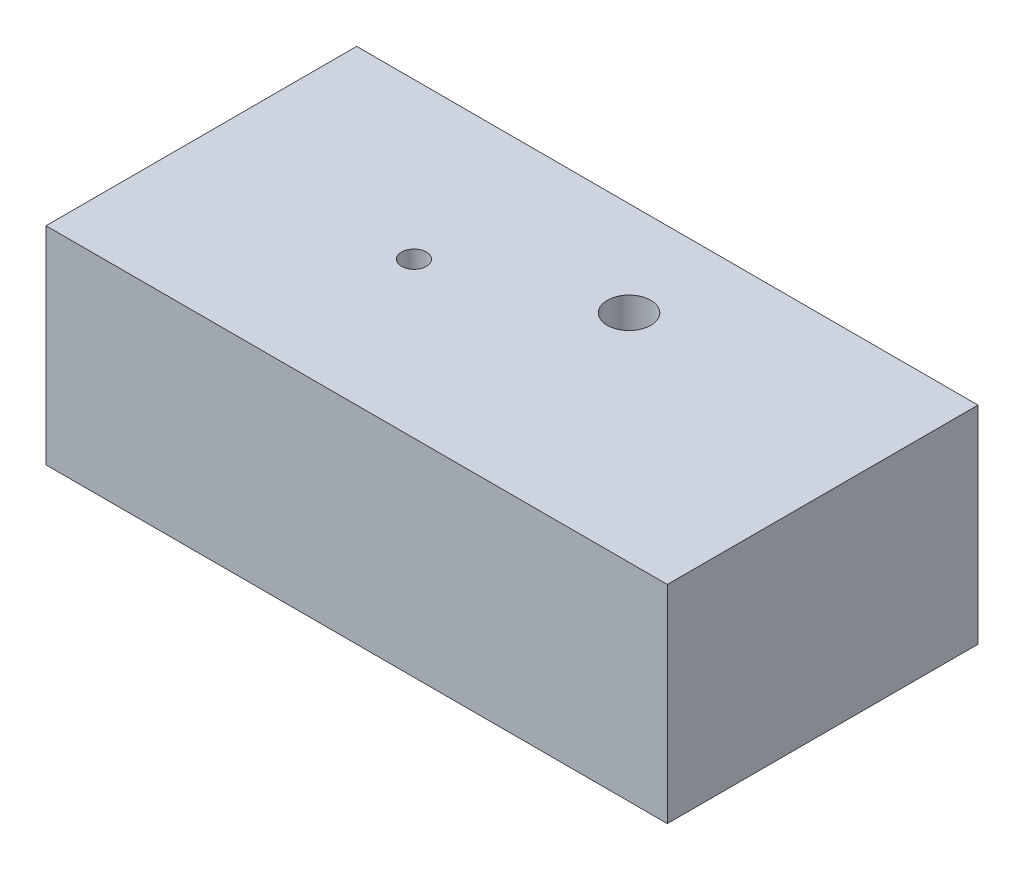
ISO-10303-21;
HEADER;
FILE_DESCRIPTION(('STEP AP214'),'2;1');
FILE_NAME('part.step','',(''),(''),'','','');
FILE_SCHEMA(('AUTOMOTIVE_DESIGN { 1 0 10303 214 1 1 1 1 }'));
ENDSEC;
DATA;
#1=APPLICATION_CONTEXT('core data for automotive mechanical design processes');
#2=APPLICATION_PROTOCOL_DEFINITION('international standard','automotive_design',2000,#1);
#3=PRODUCT_CONTEXT('',#1,'mechanical');
#4=PRODUCT('Part','Part','',(#3));
#5=PRODUCT_RELATED_PRODUCT_CATEGORY('part','',(#4));
#6=PRODUCT_DEFINITION_FORMATION('','',#4);
#7=PRODUCT_DEFINITION_CONTEXT('part definition',#1,'design');
#8=PRODUCT_DEFINITION('design','',#6,#7);
#9=PRODUCT_DEFINITION_SHAPE('','',#8);
#10=(LENGTH_UNIT() NAMED_UNIT(*) SI_UNIT(.MILLI.,.METRE.));
#11=(NAMED_UNIT(*) PLANE_ANGLE_UNIT() SI_UNIT($,.RADIAN.));
#12=(NAMED_UNIT(*) SI_UNIT($,.STERADIAN.) SOLID_ANGLE_UNIT());
#13=UNCERTAINTY_MEASURE_WITH_UNIT(LENGTH_MEASURE(1.E-05),#10,'distance_accuracy_value','');
#14=(GEOMETRIC_REPRESENTATION_CONTEXT(3) GLOBAL_UNCERTAINTY_ASSIGNED_CONTEXT((#13)) GLOBAL_UNIT_ASSIGNED_CONTEXT((#10,
#11,#12)) REPRESENTATION_CONTEXT('',''));
#15=CARTESIAN_POINT('',(0.,0.,0.));
#16=DIRECTION('',(0.,0.,1.));
#17=DIRECTION('',(1.,0.,0.));
#18=AXIS2_PLACEMENT_3D('',#15,#16,#17);
#19=CARTESIAN_POINT('',(0.,10.,0.));
#20=DIRECTION('',(0.,-1.,0.));
#21=DIRECTION('',(0.,0.,-1.));
#22=AXIS2_PLACEMENT_3D('',#19,#20,#21);
#23=PLANE('',#22);
#24=CARTESIAN_POINT('',(2.71763212599322,10.,-2.93504269607268));
#25=DIRECTION('',(0.,1.,0.));
#26=DIRECTION('',(0.,0.,1.));
#27=AXIS2_PLACEMENT_3D('',#24,#25,#26);
#28=CIRCLE('',#27,1.05);
#29=CARTESIAN_POINT('',(2.71763212599322,10.,-1.88504269607268));
#30=VERTEX_POINT('',#29);
#31=EDGE_CURVE('E100',#30,#30,#28,.T.);
#32=ORIENTED_EDGE('',*,*,#31,.F.);
#33=EDGE_LOOP('',(#32));
#34=FACE_BOUND('',#33,.T.);
#35=DIRECTION('',(0.,0.,1.));
#36=VECTOR('',#35,1.);
#37=CARTESIAN_POINT('',(-15.,10.,7.5));
#38=LINE('',#37,#36);
#39=CARTESIAN_POINT('',(-15.,10.,-7.5));
#40=VERTEX_POINT('',#39);
#41=CARTESIAN_POINT('',(-15.,10.,7.5));
#42=VERTEX_POINT('',#41);
#43=EDGE_CURVE('E85',#40,#42,#38,.T.);
#44=ORIENTED_EDGE('',*,*,#43,.T.);
#45=DIRECTION('',(1.,0.,0.));
#46=VECTOR('',#45,1.);
#47=CARTESIAN_POINT('',(-15.,10.,7.5));
#48=LINE('',#47,#46);
#49=CARTESIAN_POINT('',(15.,10.,7.5));
#50=VERTEX_POINT('',#49);
#51=EDGE_CURVE('E80',#42,#50,#48,.T.);
#52=ORIENTED_EDGE('',*,*,#51,.T.);
#53=DIRECTION('',(0.,0.,-1.));
#54=VECTOR('',#53,1.);
#55=CARTESIAN_POINT('',(15.,10.,7.5));
#56=LINE('',#55,#54);
#57=CARTESIAN_POINT('',(15.,10.,-7.5));
#58=VERTEX_POINT('',#57);
#59=EDGE_CURVE('E83',#50,#58,#56,.T.);
#60=ORIENTED_EDGE('',*,*,#59,.T.);
#61=DIRECTION('',(-1.,0.,0.));
#62=VECTOR('',#61,1.);
#63=CARTESIAN_POINT('',(-15.,10.,-7.5));
#64=LINE('',#63,#62);
#65=EDGE_CURVE('E50',#58,#40,#64,.T.);
#66=ORIENTED_EDGE('',*,*,#65,.T.);
#67=EDGE_LOOP('',(#44,#52,#60,#66));
#68=FACE_BOUND('',#67,.T.);
#69=CARTESIAN_POINT('',(-4.71856534282214,10.,0.0150364901160514));
#70=DIRECTION('',(0.,1.,0.));
#71=DIRECTION('',(0.,0.,1.));
#72=AXIS2_PLACEMENT_3D('',#69,#70,#71);
#73=CIRCLE('',#72,0.6);
#74=CARTESIAN_POINT('',(-4.71856534282214,10.,0.615036490116052));
#75=VERTEX_POINT('',#74);
#76=EDGE_CURVE('E115',#75,#75,#73,.T.);
#77=ORIENTED_EDGE('',*,*,#76,.F.);
#78=EDGE_LOOP('',(#77));
#79=FACE_BOUND('',#78,.T.);
#80=ADVANCED_FACE('F33',(#34,#68,#79),#23,.F.);
#81=CARTESIAN_POINT('',(0.,0.,0.));
#82=DIRECTION('',(0.,-1.,0.));
#83=DIRECTION('',(0.,0.,-1.));
#84=AXIS2_PLACEMENT_3D('',#81,#82,#83);
#85=PLANE('',#84);
#86=CARTESIAN_POINT('',(2.71763212599322,0.,-2.93504269607268));
#87=DIRECTION('',(0.,1.,0.));
#88=DIRECTION('',(0.,0.,1.));
#89=AXIS2_PLACEMENT_3D('',#86,#87,#88);
#90=CIRCLE('',#89,1.05);
#91=CARTESIAN_POINT('',(2.71763212599322,0.,-1.88504269607268));
#92=VERTEX_POINT('',#91);
#93=EDGE_CURVE('E112',#92,#92,#90,.T.);
#94=ORIENTED_EDGE('',*,*,#93,.T.);
#95=EDGE_LOOP('',(#94));
#96=FACE_BOUND('',#95,.T.);
#97=DIRECTION('',(0.,0.,1.));
#98=VECTOR('',#97,1.);
#99=CARTESIAN_POINT('',(-15.,0.,7.5));
#100=LINE('',#99,#98);
#101=CARTESIAN_POINT('',(-15.,0.,-7.5));
#102=VERTEX_POINT('',#101);
#103=CARTESIAN_POINT('',(-15.,0.,7.5));
#104=VERTEX_POINT('',#103);
#105=EDGE_CURVE('E97',#102,#104,#100,.T.);
#106=ORIENTED_EDGE('',*,*,#105,.F.);
#107=DIRECTION('',(-1.,0.,0.));
#108=VECTOR('',#107,1.);
#109=CARTESIAN_POINT('',(-15.,0.,-7.5));
#110=LINE('',#109,#108);
#111=CARTESIAN_POINT('',(15.,0.,-7.5));
#112=VERTEX_POINT('',#111);
#113=EDGE_CURVE('E73',#112,#102,#110,.T.);
#114=ORIENTED_EDGE('',*,*,#113,.F.);
#115=DIRECTION('',(0.,0.,-1.));
#116=VECTOR('',#115,1.);
#117=CARTESIAN_POINT('',(15.,0.,7.5));
#118=LINE('',#117,#116);
#119=CARTESIAN_POINT('',(15.,0.,7.5));
#120=VERTEX_POINT('',#119);
#121=EDGE_CURVE('E67',#120,#112,#118,.T.);
#122=ORIENTED_EDGE('',*,*,#121,.F.);
#123=DIRECTION('',(1.,0.,0.));
#124=VECTOR('',#123,1.);
#125=CARTESIAN_POINT('',(-15.,0.,7.5));
#126=LINE('',#125,#124);
#127=EDGE_CURVE('E89',#104,#120,#126,.T.);
#128=ORIENTED_EDGE('',*,*,#127,.F.);
#129=EDGE_LOOP('',(#106,#114,#122,#128));
#130=FACE_BOUND('',#129,.T.);
#131=CARTESIAN_POINT('',(-4.71856534282214,0.,0.0150364901160514));
#132=DIRECTION('',(0.,1.,0.));
#133=DIRECTION('',(0.,0.,1.));
#134=AXIS2_PLACEMENT_3D('',#131,#132,#133);
#135=CIRCLE('',#134,0.6);
#136=CARTESIAN_POINT('',(-4.71856534282214,0.,0.615036490116052));
#137=VERTEX_POINT('',#136);
#138=EDGE_CURVE('E118',#137,#137,#135,.T.);
#139=ORIENTED_EDGE('',*,*,#138,.T.);
#140=EDGE_LOOP('',(#139));
#141=FACE_BOUND('',#140,.T.);
#142=ADVANCED_FACE('F108',(#96,#130,#141),#85,.T.);
#143=CARTESIAN_POINT('',(-15.,10.,7.5));
#144=DIRECTION('',(1.,0.,0.));
#145=DIRECTION('',(0.,0.,-1.));
#146=AXIS2_PLACEMENT_3D('',#143,#144,#145);
#147=PLANE('',#146);
#148=ORIENTED_EDGE('',*,*,#105,.T.);
#149=DIRECTION('',(0.,-1.,0.));
#150=VECTOR('',#149,1.);
#151=CARTESIAN_POINT('',(-15.,10.,7.5));
#152=LINE('',#151,#150);
#153=EDGE_CURVE('E11',#42,#104,#152,.T.);
#154=ORIENTED_EDGE('',*,*,#153,.F.);
#155=ORIENTED_EDGE('',*,*,#43,.F.);
#156=DIRECTION('',(0.,-1.,0.));
#157=VECTOR('',#156,1.);
#158=CARTESIAN_POINT('',(-15.,10.,-7.5));
#159=LINE('',#158,#157);
#160=EDGE_CURVE('E93',#40,#102,#159,.T.);
#161=ORIENTED_EDGE('',*,*,#160,.T.);
#162=EDGE_LOOP('',(#148,#154,#155,#161));
#163=FACE_BOUND('',#162,.T.);
#164=ADVANCED_FACE('F35',(#163),#147,.F.);
#165=CARTESIAN_POINT('',(-15.,10.,7.5));
#166=DIRECTION('',(0.,0.,-1.));
#167=DIRECTION('',(-1.,0.,0.));
#168=AXIS2_PLACEMENT_3D('',#165,#166,#167);
#169=PLANE('',#168);
#170=ORIENTED_EDGE('',*,*,#127,.T.);
#171=DIRECTION('',(0.,-1.,0.));
#172=VECTOR('',#171,1.);
#173=CARTESIAN_POINT('',(15.,10.,7.5));
#174=LINE('',#173,#172);
#175=EDGE_CURVE('E42',#50,#120,#174,.T.);
#176=ORIENTED_EDGE('',*,*,#175,.F.);
#177=ORIENTED_EDGE('',*,*,#51,.F.);
#178=ORIENTED_EDGE('',*,*,#153,.T.);
#179=EDGE_LOOP('',(#170,#176,#177,#178));
#180=FACE_BOUND('',#179,.T.);
#181=ADVANCED_FACE('F88',(#180),#169,.F.);
#182=CARTESIAN_POINT('',(15.,10.,7.5));
#183=DIRECTION('',(-1.,0.,0.));
#184=DIRECTION('',(0.,0.,1.));
#185=AXIS2_PLACEMENT_3D('',#182,#183,#184);
#186=PLANE('',#185);
#187=ORIENTED_EDGE('',*,*,#121,.T.);
#188=DIRECTION('',(0.,-1.,0.));
#189=VECTOR('',#188,1.);
#190=CARTESIAN_POINT('',(15.,10.,-7.5));
#191=LINE('',#190,#189);
#192=EDGE_CURVE('E90',#58,#112,#191,.T.);
#193=ORIENTED_EDGE('',*,*,#192,.F.);
#194=ORIENTED_EDGE('',*,*,#59,.F.);
#195=ORIENTED_EDGE('',*,*,#175,.T.);
#196=EDGE_LOOP('',(#187,#193,#194,#195));
#197=FACE_BOUND('',#196,.T.);
#198=ADVANCED_FACE('F91',(#197),#186,.F.);
#199=CARTESIAN_POINT('',(-15.,10.,-7.5));
#200=DIRECTION('',(0.,0.,1.));
#201=DIRECTION('',(1.,0.,0.));
#202=AXIS2_PLACEMENT_3D('',#199,#200,#201);
#203=PLANE('',#202);
#204=ORIENTED_EDGE('',*,*,#113,.T.);
#205=ORIENTED_EDGE('',*,*,#160,.F.);
#206=ORIENTED_EDGE('',*,*,#65,.F.);
#207=ORIENTED_EDGE('',*,*,#192,.T.);
#208=EDGE_LOOP('',(#204,#205,#206,#207));
#209=FACE_BOUND('',#208,.T.);
#210=ADVANCED_FACE('F105',(#209),#203,.F.);
#211=CARTESIAN_POINT('',(2.71763212599322,10.,-2.93504269607268));
#212=DIRECTION('',(0.,-1.,0.));
#213=DIRECTION('',(0.,0.,-1.));
#214=AXIS2_PLACEMENT_3D('',#211,#212,#213);
#215=CYLINDRICAL_SURFACE('',#214,1.05);
#216=ORIENTED_EDGE('',*,*,#31,.T.);
#217=EDGE_LOOP('',(#216));
#218=FACE_BOUND('',#217,.T.);
#219=ORIENTED_EDGE('',*,*,#93,.F.);
#220=EDGE_LOOP('',(#219));
#221=FACE_BOUND('',#220,.T.);
#222=ADVANCED_FACE('F136',(#218,#221),#215,.F.);
#223=CARTESIAN_POINT('',(-4.71856534282214,10.,0.0150364901160514));
#224=DIRECTION('',(0.,-1.,0.));
#225=DIRECTION('',(0.,0.,-1.));
#226=AXIS2_PLACEMENT_3D('',#223,#224,#225);
#227=CYLINDRICAL_SURFACE('',#226,0.6);
#228=ORIENTED_EDGE('',*,*,#76,.T.);
#229=EDGE_LOOP('',(#228));
#230=FACE_BOUND('',#229,.T.);
#231=ORIENTED_EDGE('',*,*,#138,.F.);
#232=EDGE_LOOP('',(#231));
#233=FACE_BOUND('',#232,.T.);
#234=ADVANCED_FACE('F124',(#230,#233),#227,.F.);
#235=CLOSED_SHELL('',(#80,#142,#164,#181,#198,#210,#222,#234));
#236=MANIFOLD_SOLID_BREP('B2',#235);
#237=ADVANCED_BREP_SHAPE_REPRESENTATION('',(#18,#236),#14);
#238=SHAPE_DEFINITION_REPRESENTATION(#9,#237);
ENDSEC;
END-ISO-10303-21;
